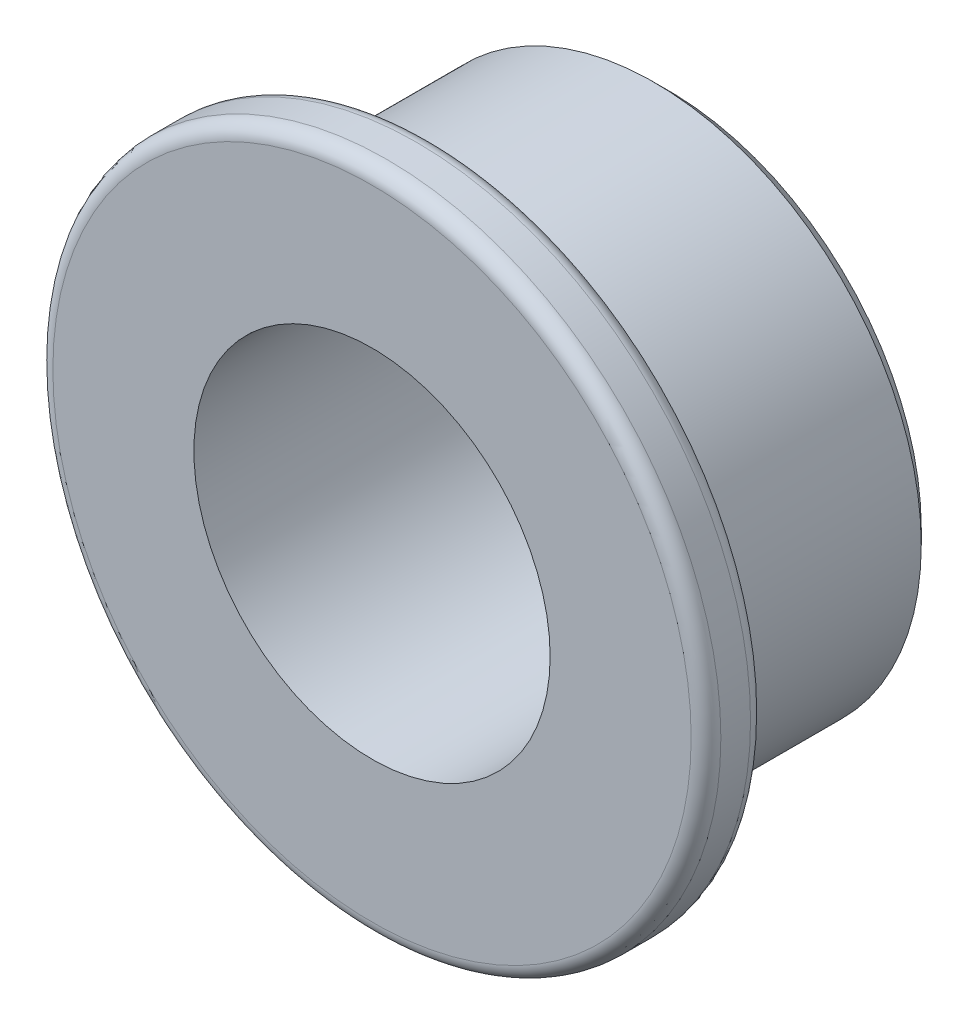
ISO-10303-21;
HEADER;
FILE_DESCRIPTION(('STEP AP214'),'2;1');
FILE_NAME('part.step','',(''),(''),'','','');
FILE_SCHEMA(('AUTOMOTIVE_DESIGN { 1 0 10303 214 1 1 1 1 }'));
ENDSEC;
DATA;
#1=APPLICATION_CONTEXT('core data for automotive mechanical design processes');
#2=APPLICATION_PROTOCOL_DEFINITION('international standard','automotive_design',2000,#1);
#3=PRODUCT_CONTEXT('',#1,'mechanical');
#4=PRODUCT('Part','Part','',(#3));
#5=PRODUCT_RELATED_PRODUCT_CATEGORY('part','',(#4));
#6=PRODUCT_DEFINITION_FORMATION('','',#4);
#7=PRODUCT_DEFINITION_CONTEXT('part definition',#1,'design');
#8=PRODUCT_DEFINITION('design','',#6,#7);
#9=PRODUCT_DEFINITION_SHAPE('','',#8);
#10=(LENGTH_UNIT() NAMED_UNIT(*) SI_UNIT(.MILLI.,.METRE.));
#11=(NAMED_UNIT(*) PLANE_ANGLE_UNIT() SI_UNIT($,.RADIAN.));
#12=(NAMED_UNIT(*) SI_UNIT($,.STERADIAN.) SOLID_ANGLE_UNIT());
#13=UNCERTAINTY_MEASURE_WITH_UNIT(LENGTH_MEASURE(1.E-05),#10,'distance_accuracy_value','');
#14=(GEOMETRIC_REPRESENTATION_CONTEXT(3) GLOBAL_UNCERTAINTY_ASSIGNED_CONTEXT((#13)) GLOBAL_UNIT_ASSIGNED_CONTEXT((#10,
#11,#12)) REPRESENTATION_CONTEXT('',''));
#15=CARTESIAN_POINT('',(0.,0.,0.));
#16=DIRECTION('',(0.,0.,1.));
#17=DIRECTION('',(1.,0.,0.));
#18=AXIS2_PLACEMENT_3D('',#15,#16,#17);
#19=CARTESIAN_POINT('',(0.,0.,-8.));
#20=DIRECTION('',(0.,0.,1.));
#21=DIRECTION('',(1.,0.,0.));
#22=AXIS2_PLACEMENT_3D('',#19,#20,#21);
#23=CYLINDRICAL_SURFACE('',#22,9.);
#24=CARTESIAN_POINT('',(0.,0.,-7.49999999999999));
#25=DIRECTION('',(0.,0.,1.));
#26=DIRECTION('',(1.,0.,0.));
#27=AXIS2_PLACEMENT_3D('',#24,#25,#26);
#28=CIRCLE('',#27,9.);
#29=CARTESIAN_POINT('',(9.,0.,-7.49999999999999));
#30=VERTEX_POINT('',#29);
#31=EDGE_CURVE('E54',#30,#30,#28,.T.);
#32=ORIENTED_EDGE('',*,*,#31,.T.);
#33=EDGE_LOOP('',(#32));
#34=FACE_BOUND('',#33,.T.);
#35=CARTESIAN_POINT('',(0.,0.,-0.8));
#36=DIRECTION('',(0.,0.,1.));
#37=DIRECTION('',(1.,0.,0.));
#38=AXIS2_PLACEMENT_3D('',#35,#36,#37);
#39=CIRCLE('',#38,9.);
#40=CARTESIAN_POINT('',(9.,0.,-0.8));
#41=VERTEX_POINT('',#40);
#42=EDGE_CURVE('E59',#41,#41,#39,.F.);
#43=ORIENTED_EDGE('',*,*,#42,.T.);
#44=EDGE_LOOP('',(#43));
#45=FACE_BOUND('',#44,.T.);
#46=ADVANCED_FACE('F45',(#34,#45),#23,.T.);
#47=CARTESIAN_POINT('',(0.,0.,-8.));
#48=DIRECTION('',(0.,0.,1.));
#49=DIRECTION('',(1.,0.,0.));
#50=AXIS2_PLACEMENT_3D('',#47,#48,#49);
#51=PLANE('',#50);
#52=CARTESIAN_POINT('',(0.,0.,-8.));
#53=DIRECTION('',(0.,0.,1.));
#54=DIRECTION('',(1.,0.,0.));
#55=AXIS2_PLACEMENT_3D('',#52,#53,#54);
#56=CIRCLE('',#55,8.49999999999999);
#57=CARTESIAN_POINT('',(8.49999999999999,0.,-8.));
#58=VERTEX_POINT('',#57);
#59=EDGE_CURVE('E10',#58,#58,#56,.F.);
#60=ORIENTED_EDGE('',*,*,#59,.T.);
#61=EDGE_LOOP('',(#60));
#62=FACE_BOUND('',#61,.T.);
#63=CARTESIAN_POINT('',(0.,0.,-8.));
#64=DIRECTION('',(0.,0.,1.));
#65=DIRECTION('',(1.,0.,0.));
#66=AXIS2_PLACEMENT_3D('',#63,#64,#65);
#67=CIRCLE('',#66,6.);
#68=CARTESIAN_POINT('',(6.,0.,-8.));
#69=VERTEX_POINT('',#68);
#70=EDGE_CURVE('E86',#69,#69,#67,.T.);
#71=ORIENTED_EDGE('',*,*,#70,.T.);
#72=EDGE_LOOP('',(#71));
#73=FACE_BOUND('',#72,.T.);
#74=ADVANCED_FACE('F110',(#62,#73),#51,.F.);
#75=CARTESIAN_POINT('',(0.,0.,-8.));
#76=DIRECTION('',(0.,0.,1.));
#77=DIRECTION('',(1.,0.,0.));
#78=AXIS2_PLACEMENT_3D('',#75,#76,#77);
#79=CYLINDRICAL_SURFACE('',#78,6.);
#80=ORIENTED_EDGE('',*,*,#70,.F.);
#81=EDGE_LOOP('',(#80));
#82=FACE_BOUND('',#81,.T.);
#83=CARTESIAN_POINT('',(0.,0.,2.));
#84=DIRECTION('',(0.,0.,1.));
#85=DIRECTION('',(1.,0.,0.));
#86=AXIS2_PLACEMENT_3D('',#83,#84,#85);
#87=CIRCLE('',#86,6.);
#88=CARTESIAN_POINT('',(6.,0.,2.));
#89=VERTEX_POINT('',#88);
#90=EDGE_CURVE('E90',#89,#89,#87,.T.);
#91=ORIENTED_EDGE('',*,*,#90,.T.);
#92=EDGE_LOOP('',(#91));
#93=FACE_BOUND('',#92,.T.);
#94=ADVANCED_FACE('F95',(#82,#93),#79,.F.);
#95=CARTESIAN_POINT('',(0.,0.,2.));
#96=DIRECTION('',(0.,0.,1.));
#97=DIRECTION('',(1.,0.,0.));
#98=AXIS2_PLACEMENT_3D('',#95,#96,#97);
#99=PLANE('',#98);
#100=CARTESIAN_POINT('',(0.,0.,2.));
#101=DIRECTION('',(0.,0.,1.));
#102=DIRECTION('',(1.,0.,0.));
#103=AXIS2_PLACEMENT_3D('',#100,#101,#102);
#104=CIRCLE('',#103,10.75);
#105=CARTESIAN_POINT('',(10.75,0.,2.));
#106=VERTEX_POINT('',#105);
#107=EDGE_CURVE('E82',#106,#106,#104,.T.);
#108=ORIENTED_EDGE('',*,*,#107,.T.);
#109=EDGE_LOOP('',(#108));
#110=FACE_BOUND('',#109,.T.);
#111=ORIENTED_EDGE('',*,*,#90,.F.);
#112=EDGE_LOOP('',(#111));
#113=FACE_BOUND('',#112,.T.);
#114=ADVANCED_FACE('F97',(#110,#113),#99,.T.);
#115=CARTESIAN_POINT('',(0.,0.,0.));
#116=DIRECTION('',(0.,0.,1.));
#117=DIRECTION('',(1.,0.,0.));
#118=AXIS2_PLACEMENT_3D('',#115,#116,#117);
#119=PLANE('',#118);
#120=CARTESIAN_POINT('',(0.,0.,0.));
#121=DIRECTION('',(0.,0.,1.));
#122=DIRECTION('',(1.,0.,0.));
#123=AXIS2_PLACEMENT_3D('',#120,#121,#122);
#124=CIRCLE('',#123,9.8);
#125=CARTESIAN_POINT('',(9.8,0.,0.));
#126=VERTEX_POINT('',#125);
#127=EDGE_CURVE('E64',#126,#126,#124,.T.);
#128=ORIENTED_EDGE('',*,*,#127,.T.);
#129=EDGE_LOOP('',(#128));
#130=FACE_BOUND('',#129,.T.);
#131=CARTESIAN_POINT('',(0.,0.,0.));
#132=DIRECTION('',(0.,0.,1.));
#133=DIRECTION('',(1.,0.,0.));
#134=AXIS2_PLACEMENT_3D('',#131,#132,#133);
#135=CIRCLE('',#134,10.75);
#136=CARTESIAN_POINT('',(10.75,0.,0.));
#137=VERTEX_POINT('',#136);
#138=EDGE_CURVE('E70',#137,#137,#135,.F.);
#139=ORIENTED_EDGE('',*,*,#138,.T.);
#140=EDGE_LOOP('',(#139));
#141=FACE_BOUND('',#140,.T.);
#142=ADVANCED_FACE('F99',(#130,#141),#119,.F.);
#143=CARTESIAN_POINT('',(0.,0.,2.));
#144=DIRECTION('',(0.,0.,-1.));
#145=DIRECTION('',(-1.,0.,0.));
#146=AXIS2_PLACEMENT_3D('',#143,#144,#145);
#147=CYLINDRICAL_SURFACE('',#146,11.25);
#148=CARTESIAN_POINT('',(0.,0.,0.5));
#149=DIRECTION('',(0.,0.,1.));
#150=DIRECTION('',(1.,0.,0.));
#151=AXIS2_PLACEMENT_3D('',#148,#149,#150);
#152=CIRCLE('',#151,11.25);
#153=CARTESIAN_POINT('',(11.25,0.,0.5));
#154=VERTEX_POINT('',#153);
#155=EDGE_CURVE('E74',#154,#154,#152,.T.);
#156=ORIENTED_EDGE('',*,*,#155,.T.);
#157=EDGE_LOOP('',(#156));
#158=FACE_BOUND('',#157,.T.);
#159=CARTESIAN_POINT('',(0.,0.,1.5));
#160=DIRECTION('',(0.,0.,1.));
#161=DIRECTION('',(1.,0.,0.));
#162=AXIS2_PLACEMENT_3D('',#159,#160,#161);
#163=CIRCLE('',#162,11.25);
#164=CARTESIAN_POINT('',(11.25,0.,1.5));
#165=VERTEX_POINT('',#164);
#166=EDGE_CURVE('E78',#165,#165,#163,.F.);
#167=ORIENTED_EDGE('',*,*,#166,.T.);
#168=EDGE_LOOP('',(#167));
#169=FACE_BOUND('',#168,.T.);
#170=ADVANCED_FACE('F107',(#158,#169),#147,.T.);
#171=CARTESIAN_POINT('',(0.,0.,1.5));
#172=DIRECTION('',(0.,0.,1.));
#173=DIRECTION('',(1.,0.,0.));
#174=AXIS2_PLACEMENT_3D('',#171,#172,#173);
#175=TOROIDAL_SURFACE('',#174,10.75,0.5);
#176=ORIENTED_EDGE('',*,*,#166,.F.);
#177=EDGE_LOOP('',(#176));
#178=FACE_BOUND('',#177,.T.);
#179=ORIENTED_EDGE('',*,*,#107,.F.);
#180=EDGE_LOOP('',(#179));
#181=FACE_BOUND('',#180,.T.);
#182=ADVANCED_FACE('F122',(#178,#181),#175,.T.);
#183=CARTESIAN_POINT('',(0.,0.,0.5));
#184=DIRECTION('',(0.,0.,1.));
#185=DIRECTION('',(1.,0.,0.));
#186=AXIS2_PLACEMENT_3D('',#183,#184,#185);
#187=TOROIDAL_SURFACE('',#186,10.75,0.5);
#188=ORIENTED_EDGE('',*,*,#138,.F.);
#189=EDGE_LOOP('',(#188));
#190=FACE_BOUND('',#189,.T.);
#191=ORIENTED_EDGE('',*,*,#155,.F.);
#192=EDGE_LOOP('',(#191));
#193=FACE_BOUND('',#192,.T.);
#194=ADVANCED_FACE('F124',(#190,#193),#187,.T.);
#195=CARTESIAN_POINT('',(0.,0.,-0.8));
#196=DIRECTION('',(0.,0.,1.));
#197=DIRECTION('',(1.,0.,0.));
#198=AXIS2_PLACEMENT_3D('',#195,#196,#197);
#199=TOROIDAL_SURFACE('',#198,9.8,0.8);
#200=ORIENTED_EDGE('',*,*,#42,.F.);
#201=EDGE_LOOP('',(#200));
#202=FACE_BOUND('',#201,.T.);
#203=ORIENTED_EDGE('',*,*,#127,.F.);
#204=EDGE_LOOP('',(#203));
#205=FACE_BOUND('',#204,.T.);
#206=ADVANCED_FACE('F127',(#202,#205),#199,.F.);
#207=CARTESIAN_POINT('',(0.,0.,-7.49999999999999));
#208=DIRECTION('',(0.,0.,1.));
#209=DIRECTION('',(1.,0.,0.));
#210=AXIS2_PLACEMENT_3D('',#207,#208,#209);
#211=CONICAL_SURFACE('',#210,9.,0.78539816339745);
#212=ORIENTED_EDGE('',*,*,#59,.F.);
#213=EDGE_LOOP('',(#212));
#214=FACE_BOUND('',#213,.T.);
#215=ORIENTED_EDGE('',*,*,#31,.F.);
#216=EDGE_LOOP('',(#215));
#217=FACE_BOUND('',#216,.T.);
#218=ADVANCED_FACE('F48',(#214,#217),#211,.T.);
#219=CLOSED_SHELL('',(#46,#74,#94,#114,#142,#170,#182,#194,#206,#218));
#220=MANIFOLD_SOLID_BREP('B2',#219);
#221=ADVANCED_BREP_SHAPE_REPRESENTATION('',(#18,#220),#14);
#222=SHAPE_DEFINITION_REPRESENTATION(#9,#221);
ENDSEC;
END-ISO-10303-21;
